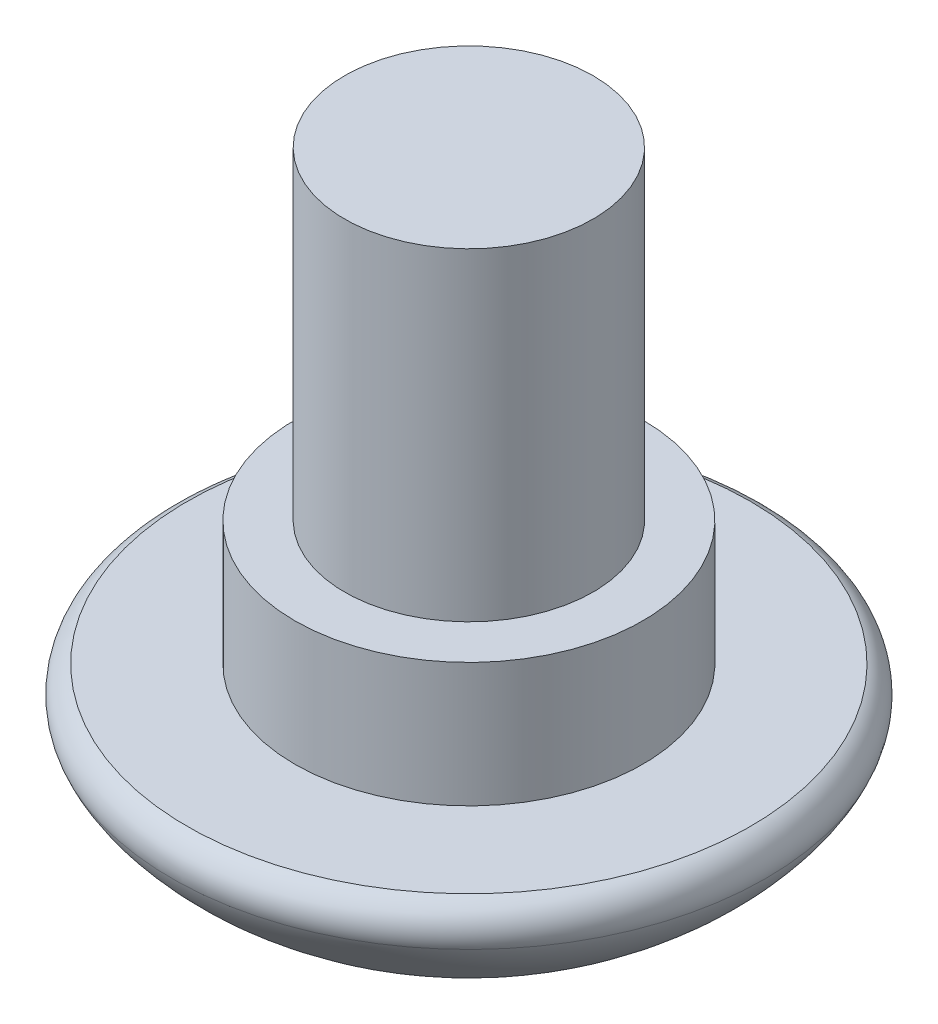
ISO-10303-21;
HEADER;
FILE_DESCRIPTION(('STEP AP214'),'2;1');
FILE_NAME('part.step','',(''),(''),'','','');
FILE_SCHEMA(('AUTOMOTIVE_DESIGN { 1 0 10303 214 1 1 1 1 }'));
ENDSEC;
DATA;
#1=APPLICATION_CONTEXT('core data for automotive mechanical design processes');
#2=APPLICATION_PROTOCOL_DEFINITION('international standard','automotive_design',2000,#1);
#3=PRODUCT_CONTEXT('',#1,'mechanical');
#4=PRODUCT('Part','Part','',(#3));
#5=PRODUCT_RELATED_PRODUCT_CATEGORY('part','',(#4));
#6=PRODUCT_DEFINITION_FORMATION('','',#4);
#7=PRODUCT_DEFINITION_CONTEXT('part definition',#1,'design');
#8=PRODUCT_DEFINITION('design','',#6,#7);
#9=PRODUCT_DEFINITION_SHAPE('','',#8);
#10=(LENGTH_UNIT() NAMED_UNIT(*) SI_UNIT(.MILLI.,.METRE.));
#11=(NAMED_UNIT(*) PLANE_ANGLE_UNIT() SI_UNIT($,.RADIAN.));
#12=(NAMED_UNIT(*) SI_UNIT($,.STERADIAN.) SOLID_ANGLE_UNIT());
#13=UNCERTAINTY_MEASURE_WITH_UNIT(LENGTH_MEASURE(1.E-05),#10,'distance_accuracy_value','');
#14=(GEOMETRIC_REPRESENTATION_CONTEXT(3) GLOBAL_UNCERTAINTY_ASSIGNED_CONTEXT((#13)) GLOBAL_UNIT_ASSIGNED_CONTEXT((#10,
#11,#12)) REPRESENTATION_CONTEXT('',''));
#15=CARTESIAN_POINT('',(0.,0.,0.));
#16=DIRECTION('',(0.,0.,1.));
#17=DIRECTION('',(1.,0.,0.));
#18=AXIS2_PLACEMENT_3D('',#15,#16,#17);
#19=CARTESIAN_POINT('',(0.,0.,0.));
#20=CARTESIAN_POINT('',(4.05719651037647,0.732493998270214,0.));
#21=CARTESIAN_POINT('',(5.69182015354944,2.56421875353578,0.));
#22=CARTESIAN_POINT('',(5.97579818383326,3.24937009216076,0.));
#23=B_SPLINE_CURVE_WITH_KNOTS('',3,(#19,#20,#21,#22),.UNSPECIFIED.,.F.,.F.,(4,4),(0.,1.),.UNSPECIFIED.);
#24=CARTESIAN_POINT('',(0.,0.,0.));
#25=DIRECTION('',(0.,-1.,0.));
#26=AXIS1_PLACEMENT('',#24,#25);
#27=SURFACE_OF_REVOLUTION('',#23,#26);
#28=CARTESIAN_POINT('',(0.,3.24937009216076,0.));
#29=DIRECTION('',(0.,-1.,0.));
#30=DIRECTION('',(0.,0.,-1.));
#31=AXIS2_PLACEMENT_3D('',#28,#29,#30);
#32=CIRCLE('',#31,5.97579818383326);
#33=CARTESIAN_POINT('',(0.,3.24937009216076,-5.97579818383326));
#34=VERTEX_POINT('',#33);
#35=EDGE_CURVE('E11',#34,#34,#32,.T.);
#36=ORIENTED_EDGE('',*,*,#35,.T.);
#37=EDGE_LOOP('',(#36));
#38=FACE_BOUND('',#37,.T.);
#39=CARTESIAN_POINT('',(0.,0.,0.));
#40=VERTEX_POINT('',#39);
#41=VERTEX_LOOP('',#40);
#42=FACE_BOUND('',#41,.T.);
#43=ADVANCED_FACE('F34',(#38,#42),#27,.F.);
#44=CARTESIAN_POINT('',(0.,3.46932256655865,0.));
#45=DIRECTION('',(0.,-1.,0.));
#46=DIRECTION('',(0.,0.,-1.));
#47=AXIS2_PLACEMENT_3D('',#44,#45,#46);
#48=TOROIDAL_SURFACE('',#47,5.44512075038191,0.574454201280027);
#49=ORIENTED_EDGE('',*,*,#35,.F.);
#50=EDGE_LOOP('',(#49));
#51=FACE_BOUND('',#50,.T.);
#52=CARTESIAN_POINT('',(0.,4.,0.));
#53=DIRECTION('',(0.,-1.,0.));
#54=DIRECTION('',(0.,0.,-1.));
#55=AXIS2_PLACEMENT_3D('',#52,#53,#54);
#56=CIRCLE('',#55,5.66507322480395);
#57=CARTESIAN_POINT('',(0.,4.,-5.66507322480395));
#58=VERTEX_POINT('',#57);
#59=EDGE_CURVE('E41',#58,#58,#56,.T.);
#60=ORIENTED_EDGE('',*,*,#59,.T.);
#61=EDGE_LOOP('',(#60));
#62=FACE_BOUND('',#61,.T.);
#63=ADVANCED_FACE('F45',(#51,#62),#48,.T.);
#64=CARTESIAN_POINT('',(0.,4.,0.));
#65=DIRECTION('',(0.,-1.,0.));
#66=DIRECTION('',(0.,0.,-1.));
#67=AXIS2_PLACEMENT_3D('',#64,#65,#66);
#68=PLANE('',#67);
#69=ORIENTED_EDGE('',*,*,#59,.F.);
#70=EDGE_LOOP('',(#69));
#71=FACE_BOUND('',#70,.T.);
#72=CARTESIAN_POINT('',(0.,4.,0.));
#73=DIRECTION('',(0.,-1.,0.));
#74=DIRECTION('',(0.,0.,-1.));
#75=AXIS2_PLACEMENT_3D('',#72,#73,#74);
#76=CIRCLE('',#75,3.5);
#77=CARTESIAN_POINT('',(0.,4.,-3.5));
#78=VERTEX_POINT('',#77);
#79=EDGE_CURVE('E57',#78,#78,#76,.T.);
#80=ORIENTED_EDGE('',*,*,#79,.T.);
#81=EDGE_LOOP('',(#80));
#82=FACE_BOUND('',#81,.T.);
#83=ADVANCED_FACE('F50',(#71,#82),#68,.F.);
#84=CARTESIAN_POINT('',(0.,0.,0.));
#85=DIRECTION('',(0.,-1.,0.));
#86=DIRECTION('',(0.,0.,-1.));
#87=AXIS2_PLACEMENT_3D('',#84,#85,#86);
#88=CYLINDRICAL_SURFACE('',#87,3.5);
#89=CARTESIAN_POINT('',(0.,6.5,0.));
#90=DIRECTION('',(0.,-1.,0.));
#91=DIRECTION('',(0.,0.,-1.));
#92=AXIS2_PLACEMENT_3D('',#89,#90,#91);
#93=CIRCLE('',#92,3.5);
#94=CARTESIAN_POINT('',(0.,6.5,-3.5));
#95=VERTEX_POINT('',#94);
#96=EDGE_CURVE('E59',#95,#95,#93,.T.);
#97=ORIENTED_EDGE('',*,*,#96,.T.);
#98=EDGE_LOOP('',(#97));
#99=FACE_BOUND('',#98,.T.);
#100=ORIENTED_EDGE('',*,*,#79,.F.);
#101=EDGE_LOOP('',(#100));
#102=FACE_BOUND('',#101,.T.);
#103=ADVANCED_FACE('F91',(#99,#102),#88,.T.);
#104=CARTESIAN_POINT('',(0.,6.5,0.));
#105=DIRECTION('',(0.,1.,0.));
#106=DIRECTION('',(0.,0.,1.));
#107=AXIS2_PLACEMENT_3D('',#104,#105,#106);
#108=PLANE('',#107);
#109=CARTESIAN_POINT('',(0.,6.5,0.));
#110=DIRECTION('',(0.,-1.,0.));
#111=DIRECTION('',(0.,0.,-1.));
#112=AXIS2_PLACEMENT_3D('',#109,#110,#111);
#113=CIRCLE('',#112,2.5);
#114=CARTESIAN_POINT('',(0.,6.5,-2.5));
#115=VERTEX_POINT('',#114);
#116=EDGE_CURVE('E64',#115,#115,#113,.T.);
#117=ORIENTED_EDGE('',*,*,#116,.T.);
#118=EDGE_LOOP('',(#117));
#119=FACE_BOUND('',#118,.T.);
#120=ORIENTED_EDGE('',*,*,#96,.F.);
#121=EDGE_LOOP('',(#120));
#122=FACE_BOUND('',#121,.T.);
#123=ADVANCED_FACE('F86',(#119,#122),#108,.T.);
#124=CARTESIAN_POINT('',(0.,0.,0.));
#125=DIRECTION('',(0.,-1.,0.));
#126=DIRECTION('',(0.,0.,-1.));
#127=AXIS2_PLACEMENT_3D('',#124,#125,#126);
#128=CYLINDRICAL_SURFACE('',#127,2.5);
#129=CARTESIAN_POINT('',(0.,13.,0.));
#130=DIRECTION('',(0.,-1.,0.));
#131=DIRECTION('',(0.,0.,-1.));
#132=AXIS2_PLACEMENT_3D('',#129,#130,#131);
#133=CIRCLE('',#132,2.5);
#134=CARTESIAN_POINT('',(0.,13.,-2.5));
#135=VERTEX_POINT('',#134);
#136=EDGE_CURVE('E67',#135,#135,#133,.T.);
#137=ORIENTED_EDGE('',*,*,#136,.T.);
#138=EDGE_LOOP('',(#137));
#139=FACE_BOUND('',#138,.T.);
#140=ORIENTED_EDGE('',*,*,#116,.F.);
#141=EDGE_LOOP('',(#140));
#142=FACE_BOUND('',#141,.T.);
#143=ADVANCED_FACE('F77',(#139,#142),#128,.T.);
#144=CARTESIAN_POINT('',(0.,13.,0.));
#145=DIRECTION('',(0.,1.,0.));
#146=DIRECTION('',(0.,0.,1.));
#147=AXIS2_PLACEMENT_3D('',#144,#145,#146);
#148=PLANE('',#147);
#149=ORIENTED_EDGE('',*,*,#136,.F.);
#150=EDGE_LOOP('',(#149));
#151=FACE_BOUND('',#150,.T.);
#152=ADVANCED_FACE('F80',(#151),#148,.T.);
#153=CLOSED_SHELL('',(#43,#63,#83,#103,#123,#143,#152));
#154=MANIFOLD_SOLID_BREP('B2',#153);
#155=ADVANCED_BREP_SHAPE_REPRESENTATION('',(#18,#154),#14);
#156=SHAPE_DEFINITION_REPRESENTATION(#9,#155);
ENDSEC;
END-ISO-10303-21;
